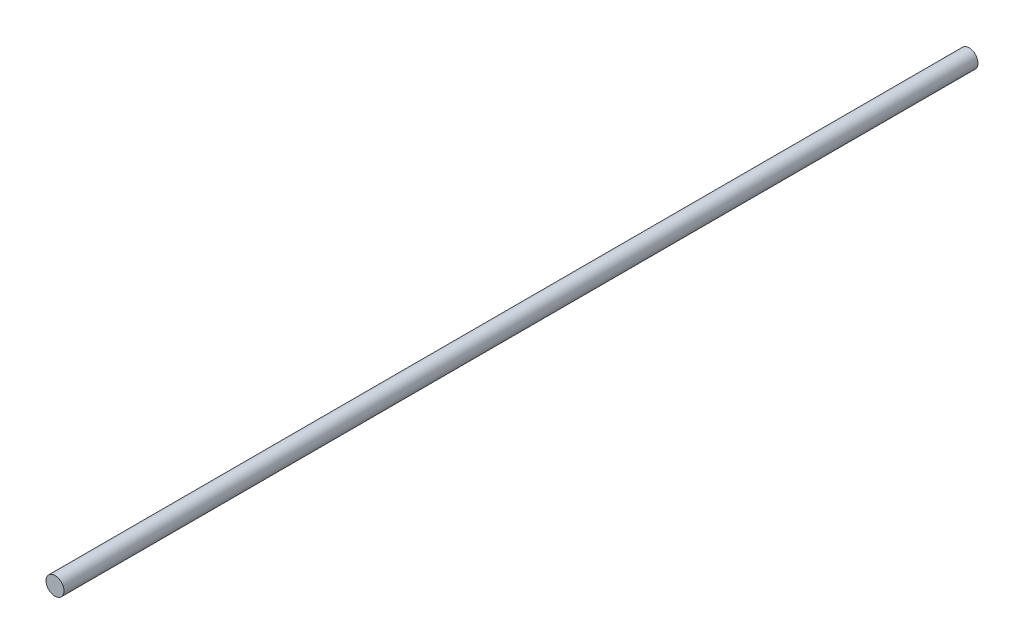
ISO-10303-21;
HEADER;
FILE_DESCRIPTION(('STEP AP214'),'2;1');
FILE_NAME('part.step','',(''),(''),'','','');
FILE_SCHEMA(('AUTOMOTIVE_DESIGN { 1 0 10303 214 1 1 1 1 }'));
ENDSEC;
DATA;
#1=APPLICATION_CONTEXT('core data for automotive mechanical design processes');
#2=APPLICATION_PROTOCOL_DEFINITION('international standard','automotive_design',2000,#1);
#3=PRODUCT_CONTEXT('',#1,'mechanical');
#4=PRODUCT('Part','Part','',(#3));
#5=PRODUCT_RELATED_PRODUCT_CATEGORY('part','',(#4));
#6=PRODUCT_DEFINITION_FORMATION('','',#4);
#7=PRODUCT_DEFINITION_CONTEXT('part definition',#1,'design');
#8=PRODUCT_DEFINITION('design','',#6,#7);
#9=PRODUCT_DEFINITION_SHAPE('','',#8);
#10=(LENGTH_UNIT() NAMED_UNIT(*) SI_UNIT(.MILLI.,.METRE.));
#11=(NAMED_UNIT(*) PLANE_ANGLE_UNIT() SI_UNIT($,.RADIAN.));
#12=(NAMED_UNIT(*) SI_UNIT($,.STERADIAN.) SOLID_ANGLE_UNIT());
#13=UNCERTAINTY_MEASURE_WITH_UNIT(LENGTH_MEASURE(1.E-05),#10,'distance_accuracy_value','');
#14=(GEOMETRIC_REPRESENTATION_CONTEXT(3) GLOBAL_UNCERTAINTY_ASSIGNED_CONTEXT((#13)) GLOBAL_UNIT_ASSIGNED_CONTEXT((#10,
#11,#12)) REPRESENTATION_CONTEXT('',''));
#15=CARTESIAN_POINT('',(0.,0.,0.));
#16=DIRECTION('',(0.,0.,1.));
#17=DIRECTION('',(1.,0.,0.));
#18=AXIS2_PLACEMENT_3D('',#15,#16,#17);
#19=CARTESIAN_POINT('',(1000.,642.,-621.970562748477));
#20=DIRECTION('',(0.,0.,1.));
#21=DIRECTION('',(1.,0.,0.));
#22=AXIS2_PLACEMENT_3D('',#19,#20,#21);
#23=CYLINDRICAL_SURFACE('',#22,6.0000000000001);
#24=CARTESIAN_POINT('',(1000.,642.,-605.));
#25=DIRECTION('',(0.,0.,1.));
#26=DIRECTION('',(0.,-1.,0.));
#27=AXIS2_PLACEMENT_3D('',#24,#25,#26);
#28=CIRCLE('',#27,6.0000000000001);
#29=CARTESIAN_POINT('',(1000.,636.,-605.));
#30=VERTEX_POINT('',#29);
#31=EDGE_CURVE('E10',#30,#30,#28,.F.);
#32=ORIENTED_EDGE('',*,*,#31,.F.);
#33=EDGE_LOOP('',(#32));
#34=FACE_BOUND('',#33,.T.);
#35=CARTESIAN_POINT('',(1000.,642.,5.));
#36=DIRECTION('',(0.,0.,1.));
#37=DIRECTION('',(1.,0.,0.));
#38=AXIS2_PLACEMENT_3D('',#35,#36,#37);
#39=CIRCLE('',#38,6.0000000000001);
#40=CARTESIAN_POINT('',(1006.,642.,5.));
#41=VERTEX_POINT('',#40);
#42=EDGE_CURVE('E37',#41,#41,#39,.T.);
#43=ORIENTED_EDGE('',*,*,#42,.F.);
#44=EDGE_LOOP('',(#43));
#45=FACE_BOUND('',#44,.T.);
#46=ADVANCED_FACE('F31',(#34,#45),#23,.T.);
#47=CARTESIAN_POINT('',(1000.,642.,5.));
#48=DIRECTION('',(0.,0.,1.));
#49=DIRECTION('',(1.,0.,0.));
#50=AXIS2_PLACEMENT_3D('',#47,#48,#49);
#51=PLANE('',#50);
#52=ORIENTED_EDGE('',*,*,#42,.T.);
#53=EDGE_LOOP('',(#52));
#54=FACE_BOUND('',#53,.T.);
#55=ADVANCED_FACE('F43',(#54),#51,.T.);
#56=CARTESIAN_POINT('',(1000.00000000005,641.999999999998,-605.));
#57=DIRECTION('',(0.,0.,1.));
#58=DIRECTION('',(0.952062088390576,0.305904854242908,0.));
#59=AXIS2_PLACEMENT_3D('',#56,#57,#58);
#60=PLANE('',#59);
#61=ORIENTED_EDGE('',*,*,#31,.T.);
#62=EDGE_LOOP('',(#61));
#63=FACE_BOUND('',#62,.T.);
#64=ADVANCED_FACE('F50',(#63),#60,.F.);
#65=CLOSED_SHELL('',(#46,#55,#64));
#66=MANIFOLD_SOLID_BREP('B2',#65);
#67=ADVANCED_BREP_SHAPE_REPRESENTATION('',(#18,#66),#14);
#68=SHAPE_DEFINITION_REPRESENTATION(#9,#67);
ENDSEC;
END-ISO-10303-21;
